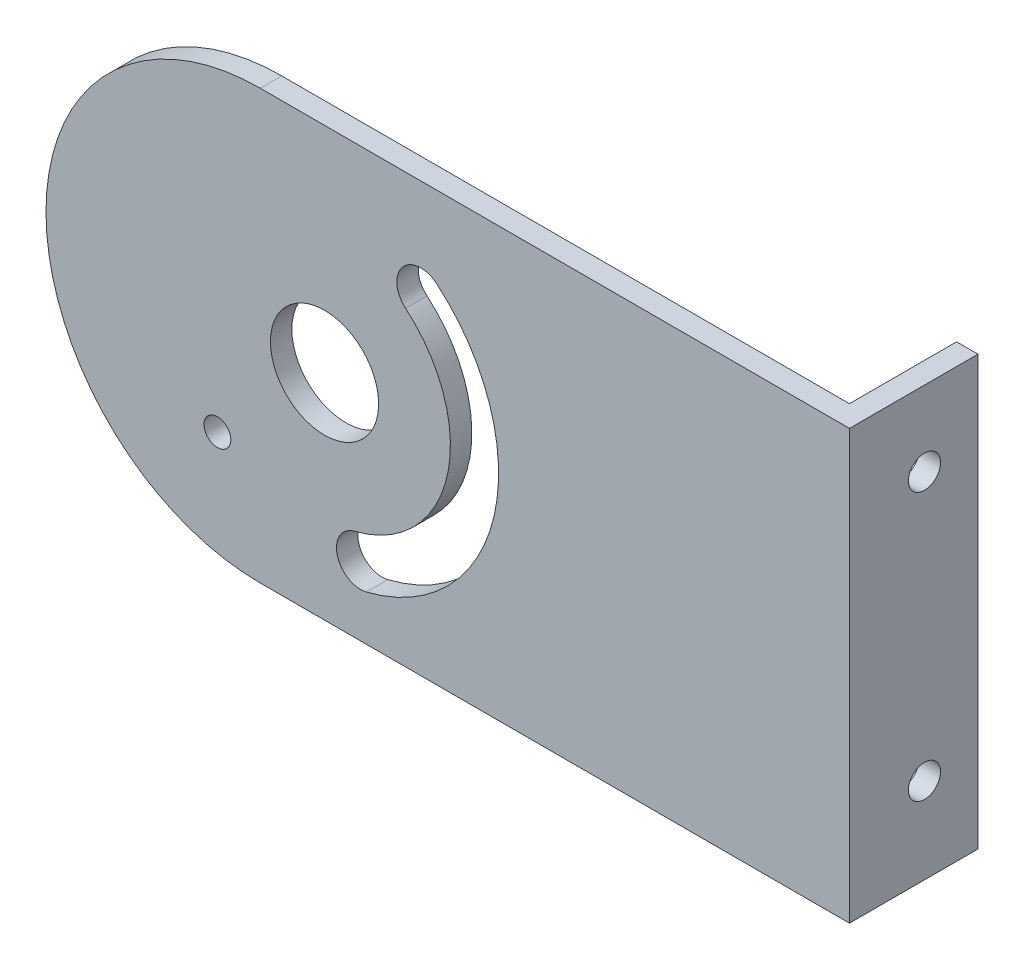
ISO-10303-21;
HEADER;
FILE_DESCRIPTION(('STEP AP214'),'2;1');
FILE_NAME('part.step','',(''),(''),'','','');
FILE_SCHEMA(('AUTOMOTIVE_DESIGN { 1 0 10303 214 1 1 1 1 }'));
ENDSEC;
DATA;
#1=APPLICATION_CONTEXT('core data for automotive mechanical design processes');
#2=APPLICATION_PROTOCOL_DEFINITION('international standard','automotive_design',2000,#1);
#3=PRODUCT_CONTEXT('',#1,'mechanical');
#4=PRODUCT('Part','Part','',(#3));
#5=PRODUCT_RELATED_PRODUCT_CATEGORY('part','',(#4));
#6=PRODUCT_DEFINITION_FORMATION('','',#4);
#7=PRODUCT_DEFINITION_CONTEXT('part definition',#1,'design');
#8=PRODUCT_DEFINITION('design','',#6,#7);
#9=PRODUCT_DEFINITION_SHAPE('','',#8);
#10=(LENGTH_UNIT() NAMED_UNIT(*) SI_UNIT(.MILLI.,.METRE.));
#11=(NAMED_UNIT(*) PLANE_ANGLE_UNIT() SI_UNIT($,.RADIAN.));
#12=(NAMED_UNIT(*) SI_UNIT($,.STERADIAN.) SOLID_ANGLE_UNIT());
#13=UNCERTAINTY_MEASURE_WITH_UNIT(LENGTH_MEASURE(1.E-05),#10,'distance_accuracy_value','');
#14=(GEOMETRIC_REPRESENTATION_CONTEXT(3) GLOBAL_UNCERTAINTY_ASSIGNED_CONTEXT((#13)) GLOBAL_UNIT_ASSIGNED_CONTEXT((#10,
#11,#12)) REPRESENTATION_CONTEXT('',''));
#15=CARTESIAN_POINT('',(0.,0.,0.));
#16=DIRECTION('',(0.,0.,1.));
#17=DIRECTION('',(1.,0.,0.));
#18=AXIS2_PLACEMENT_3D('',#15,#16,#17);
#19=CARTESIAN_POINT('',(75.,0.,2.));
#20=DIRECTION('',(0.,1.,0.));
#21=DIRECTION('',(-1.,0.,0.));
#22=AXIS2_PLACEMENT_3D('',#19,#20,#21);
#23=PLANE('',#22);
#24=DIRECTION('',(1.,0.,0.));
#25=VECTOR('',#24,1.);
#26=CARTESIAN_POINT('',(75.,0.,2.));
#27=LINE('',#26,#25);
#28=CARTESIAN_POINT('',(20.,0.,2.));
#29=VERTEX_POINT('',#28);
#30=CARTESIAN_POINT('',(75.,0.,2.));
#31=VERTEX_POINT('',#30);
#32=EDGE_CURVE('E211',#29,#31,#27,.T.);
#33=ORIENTED_EDGE('',*,*,#32,.F.);
#34=DIRECTION('',(0.,0.,-1.));
#35=VECTOR('',#34,1.);
#36=CARTESIAN_POINT('',(20.,0.,2.));
#37=LINE('',#36,#35);
#38=CARTESIAN_POINT('',(20.,0.,0.));
#39=VERTEX_POINT('',#38);
#40=EDGE_CURVE('E138',#29,#39,#37,.T.);
#41=ORIENTED_EDGE('',*,*,#40,.T.);
#42=DIRECTION('',(1.,0.,0.));
#43=VECTOR('',#42,1.);
#44=CARTESIAN_POINT('',(75.,0.,0.));
#45=LINE('',#44,#43);
#46=CARTESIAN_POINT('',(73.,0.,0.));
#47=VERTEX_POINT('',#46);
#48=EDGE_CURVE('E208',#39,#47,#45,.T.);
#49=ORIENTED_EDGE('',*,*,#48,.T.);
#50=DIRECTION('',(0.,0.,1.));
#51=VECTOR('',#50,1.);
#52=CARTESIAN_POINT('',(73.,0.,-10.));
#53=LINE('',#52,#51);
#54=CARTESIAN_POINT('',(73.,0.,-10.));
#55=VERTEX_POINT('',#54);
#56=EDGE_CURVE('E144',#55,#47,#53,.T.);
#57=ORIENTED_EDGE('',*,*,#56,.F.);
#58=DIRECTION('',(-1.,0.,0.));
#59=VECTOR('',#58,1.);
#60=CARTESIAN_POINT('',(75.,0.,-10.));
#61=LINE('',#60,#59);
#62=CARTESIAN_POINT('',(75.,0.,-10.));
#63=VERTEX_POINT('',#62);
#64=EDGE_CURVE('E142',#63,#55,#61,.T.);
#65=ORIENTED_EDGE('',*,*,#64,.F.);
#66=DIRECTION('',(0.,0.,-1.));
#67=VECTOR('',#66,1.);
#68=CARTESIAN_POINT('',(75.,0.,2.));
#69=LINE('',#68,#67);
#70=EDGE_CURVE('E129',#31,#63,#69,.T.);
#71=ORIENTED_EDGE('',*,*,#70,.F.);
#72=EDGE_LOOP('',(#33,#41,#49,#57,#65,#71));
#73=FACE_BOUND('',#72,.T.);
#74=ADVANCED_FACE('F43',(#73),#23,.F.);
#75=CARTESIAN_POINT('',(75.,40.,2.));
#76=DIRECTION('',(-1.,0.,0.));
#77=DIRECTION('',(0.,0.,1.));
#78=AXIS2_PLACEMENT_3D('',#75,#76,#77);
#79=PLANE('',#78);
#80=CARTESIAN_POINT('',(75.,33.,-5.));
#81=DIRECTION('',(-1.,0.,0.));
#82=DIRECTION('',(0.,0.,1.));
#83=AXIS2_PLACEMENT_3D('',#80,#81,#82);
#84=CIRCLE('',#83,1.5);
#85=CARTESIAN_POINT('',(75.,33.,-3.5));
#86=VERTEX_POINT('',#85);
#87=EDGE_CURVE('E154',#86,#86,#84,.T.);
#88=ORIENTED_EDGE('',*,*,#87,.T.);
#89=EDGE_LOOP('',(#88));
#90=FACE_BOUND('',#89,.T.);
#91=CARTESIAN_POINT('',(75.,8.,-5.));
#92=DIRECTION('',(-1.,0.,0.));
#93=DIRECTION('',(0.,0.,1.));
#94=AXIS2_PLACEMENT_3D('',#91,#92,#93);
#95=CIRCLE('',#94,1.5);
#96=CARTESIAN_POINT('',(75.,8.,-3.5));
#97=VERTEX_POINT('',#96);
#98=EDGE_CURVE('E157',#97,#97,#95,.T.);
#99=ORIENTED_EDGE('',*,*,#98,.T.);
#100=EDGE_LOOP('',(#99));
#101=FACE_BOUND('',#100,.T.);
#102=ORIENTED_EDGE('',*,*,#70,.T.);
#103=DIRECTION('',(0.,-1.,0.));
#104=VECTOR('',#103,1.);
#105=CARTESIAN_POINT('',(75.,0.,-10.));
#106=LINE('',#105,#104);
#107=CARTESIAN_POINT('',(75.,40.,-10.));
#108=VERTEX_POINT('',#107);
#109=EDGE_CURVE('E134',#108,#63,#106,.T.);
#110=ORIENTED_EDGE('',*,*,#109,.F.);
#111=DIRECTION('',(0.,0.,-1.));
#112=VECTOR('',#111,1.);
#113=CARTESIAN_POINT('',(75.,40.,2.));
#114=LINE('',#113,#112);
#115=CARTESIAN_POINT('',(75.,40.,2.));
#116=VERTEX_POINT('',#115);
#117=EDGE_CURVE('E139',#116,#108,#114,.T.);
#118=ORIENTED_EDGE('',*,*,#117,.F.);
#119=DIRECTION('',(0.,1.,0.));
#120=VECTOR('',#119,1.);
#121=CARTESIAN_POINT('',(75.,40.,2.));
#122=LINE('',#121,#120);
#123=EDGE_CURVE('E135',#31,#116,#122,.T.);
#124=ORIENTED_EDGE('',*,*,#123,.F.);
#125=EDGE_LOOP('',(#102,#110,#118,#124));
#126=FACE_BOUND('',#125,.T.);
#127=ADVANCED_FACE('F131',(#90,#101,#126),#79,.F.);
#128=CARTESIAN_POINT('',(0.,40.,2.));
#129=DIRECTION('',(0.,-1.,0.));
#130=DIRECTION('',(0.,0.,-1.));
#131=AXIS2_PLACEMENT_3D('',#128,#129,#130);
#132=PLANE('',#131);
#133=ORIENTED_EDGE('',*,*,#117,.T.);
#134=DIRECTION('',(1.,0.,0.));
#135=VECTOR('',#134,1.);
#136=CARTESIAN_POINT('',(75.,40.,-10.));
#137=LINE('',#136,#135);
#138=CARTESIAN_POINT('',(73.,40.,-10.));
#139=VERTEX_POINT('',#138);
#140=EDGE_CURVE('E152',#139,#108,#137,.T.);
#141=ORIENTED_EDGE('',*,*,#140,.F.);
#142=DIRECTION('',(0.,0.,1.));
#143=VECTOR('',#142,1.);
#144=CARTESIAN_POINT('',(73.,40.,-10.));
#145=LINE('',#144,#143);
#146=CARTESIAN_POINT('',(73.,40.,0.));
#147=VERTEX_POINT('',#146);
#148=EDGE_CURVE('E161',#139,#147,#145,.T.);
#149=ORIENTED_EDGE('',*,*,#148,.T.);
#150=DIRECTION('',(-1.,0.,0.));
#151=VECTOR('',#150,1.);
#152=CARTESIAN_POINT('',(0.,40.,0.));
#153=LINE('',#152,#151);
#154=CARTESIAN_POINT('',(20.,40.,0.));
#155=VERTEX_POINT('',#154);
#156=EDGE_CURVE('E213',#147,#155,#153,.T.);
#157=ORIENTED_EDGE('',*,*,#156,.T.);
#158=DIRECTION('',(0.,0.,-1.));
#159=VECTOR('',#158,1.);
#160=CARTESIAN_POINT('',(20.,40.,2.));
#161=LINE('',#160,#159);
#162=CARTESIAN_POINT('',(20.,40.,2.));
#163=VERTEX_POINT('',#162);
#164=EDGE_CURVE('E11',#155,#163,#161,.F.);
#165=ORIENTED_EDGE('',*,*,#164,.T.);
#166=DIRECTION('',(-1.,0.,0.));
#167=VECTOR('',#166,1.);
#168=CARTESIAN_POINT('',(0.,40.,2.));
#169=LINE('',#168,#167);
#170=EDGE_CURVE('E215',#116,#163,#169,.T.);
#171=ORIENTED_EDGE('',*,*,#170,.F.);
#172=EDGE_LOOP('',(#133,#141,#149,#157,#165,#171));
#173=FACE_BOUND('',#172,.T.);
#174=ADVANCED_FACE('F241',(#173),#132,.F.);
#175=CARTESIAN_POINT('',(0.,0.,2.));
#176=DIRECTION('',(0.,0.,-1.));
#177=DIRECTION('',(-1.,0.,0.));
#178=AXIS2_PLACEMENT_3D('',#175,#176,#177);
#179=PLANE('',#178);
#180=CARTESIAN_POINT('',(16.,10.2020410288673,2.));
#181=DIRECTION('',(0.,0.,-1.));
#182=DIRECTION('',(-1.,0.,0.));
#183=AXIS2_PLACEMENT_3D('',#180,#181,#182);
#184=CIRCLE('',#183,1.25);
#185=CARTESIAN_POINT('',(14.75,10.2020410288673,2.));
#186=VERTEX_POINT('',#185);
#187=EDGE_CURVE('E202',#186,#186,#184,.T.);
#188=ORIENTED_EDGE('',*,*,#187,.T.);
#189=EDGE_LOOP('',(#188));
#190=FACE_BOUND('',#189,.T.);
#191=CARTESIAN_POINT('',(26.,20.,2.));
#192=DIRECTION('',(0.,0.,1.));
#193=DIRECTION('',(-1.,0.,0.));
#194=AXIS2_PLACEMENT_3D('',#191,#192,#193);
#195=CIRCLE('',#194,11.75);
#196=CARTESIAN_POINT('',(28.825815980141,8.59485799972751,2.));
#197=VERTEX_POINT('',#196);
#198=CARTESIAN_POINT('',(33.5535714285714,29.0003365866766,2.));
#199=VERTEX_POINT('',#198);
#200=EDGE_CURVE('E169',#197,#199,#195,.T.);
#201=ORIENTED_EDGE('',*,*,#200,.T.);
#202=CARTESIAN_POINT('',(35.,30.7238052947636,2.));
#203=DIRECTION('',(0.,0.,-1.));
#204=DIRECTION('',(-1.,0.,0.));
#205=AXIS2_PLACEMENT_3D('',#202,#203,#204);
#206=CIRCLE('',#205,2.25000000000001);
#207=CARTESIAN_POINT('',(36.4464285714286,32.4472740028506,2.));
#208=VERTEX_POINT('',#207);
#209=EDGE_CURVE('E181',#199,#208,#206,.T.);
#210=ORIENTED_EDGE('',*,*,#209,.T.);
#211=CARTESIAN_POINT('',(26.,20.,2.));
#212=DIRECTION('',(0.,0.,-1.));
#213=DIRECTION('',(-1.,0.,0.));
#214=AXIS2_PLACEMENT_3D('',#211,#212,#213);
#215=CIRCLE('',#214,16.25);
#216=CARTESIAN_POINT('',(29.9080433767907,4.22693127621888,2.));
#217=VERTEX_POINT('',#216);
#218=EDGE_CURVE('E195',#208,#217,#215,.T.);
#219=ORIENTED_EDGE('',*,*,#218,.T.);
#220=CARTESIAN_POINT('',(29.3669296784659,6.4108946379732,2.));
#221=DIRECTION('',(0.,0.,-1.));
#222=DIRECTION('',(-1.,0.,0.));
#223=AXIS2_PLACEMENT_3D('',#220,#221,#222);
#224=CIRCLE('',#223,2.25000000000001);
#225=EDGE_CURVE('E192',#217,#197,#224,.T.);
#226=ORIENTED_EDGE('',*,*,#225,.T.);
#227=EDGE_LOOP('',(#201,#210,#219,#226));
#228=FACE_BOUND('',#227,.T.);
#229=CARTESIAN_POINT('',(26.,20.,2.));
#230=DIRECTION('',(0.,0.,-1.));
#231=DIRECTION('',(-1.,0.,0.));
#232=AXIS2_PLACEMENT_3D('',#229,#230,#231);
#233=CIRCLE('',#232,5.05);
#234=CARTESIAN_POINT('',(20.95,20.,2.));
#235=VERTEX_POINT('',#234);
#236=EDGE_CURVE('E205',#235,#235,#233,.T.);
#237=ORIENTED_EDGE('',*,*,#236,.T.);
#238=EDGE_LOOP('',(#237));
#239=FACE_BOUND('',#238,.T.);
#240=CARTESIAN_POINT('',(20.,20.,2.));
#241=DIRECTION('',(0.,0.,-1.));
#242=DIRECTION('',(-1.,0.,0.));
#243=AXIS2_PLACEMENT_3D('',#240,#241,#242);
#244=CIRCLE('',#243,20.);
#245=CARTESIAN_POINT('',(0.,20.,2.));
#246=VERTEX_POINT('',#245);
#247=EDGE_CURVE('E67',#163,#246,#244,.F.);
#248=ORIENTED_EDGE('',*,*,#247,.T.);
#249=CARTESIAN_POINT('',(20.,20.,2.));
#250=DIRECTION('',(0.,0.,-1.));
#251=DIRECTION('',(-1.,0.,0.));
#252=AXIS2_PLACEMENT_3D('',#249,#250,#251);
#253=CIRCLE('',#252,20.);
#254=EDGE_CURVE('E52',#246,#29,#253,.F.);
#255=ORIENTED_EDGE('',*,*,#254,.T.);
#256=ORIENTED_EDGE('',*,*,#32,.T.);
#257=ORIENTED_EDGE('',*,*,#123,.T.);
#258=ORIENTED_EDGE('',*,*,#170,.T.);
#259=EDGE_LOOP('',(#248,#255,#256,#257,#258));
#260=FACE_BOUND('',#259,.T.);
#261=ADVANCED_FACE('F229',(#190,#228,#239,#260),#179,.F.);
#262=CARTESIAN_POINT('',(0.,0.,0.));
#263=DIRECTION('',(0.,0.,-1.));
#264=DIRECTION('',(-1.,0.,0.));
#265=AXIS2_PLACEMENT_3D('',#262,#263,#264);
#266=PLANE('',#265);
#267=DIRECTION('',(0.,1.,0.));
#268=VECTOR('',#267,1.);
#269=CARTESIAN_POINT('',(73.,0.,0.));
#270=LINE('',#269,#268);
#271=EDGE_CURVE('E59',#47,#147,#270,.T.);
#272=ORIENTED_EDGE('',*,*,#271,.F.);
#273=ORIENTED_EDGE('',*,*,#48,.F.);
#274=CARTESIAN_POINT('',(20.,20.,0.));
#275=DIRECTION('',(0.,0.,-1.));
#276=DIRECTION('',(-1.,0.,0.));
#277=AXIS2_PLACEMENT_3D('',#274,#275,#276);
#278=CIRCLE('',#277,20.);
#279=CARTESIAN_POINT('',(0.,20.,0.));
#280=VERTEX_POINT('',#279);
#281=EDGE_CURVE('E225',#39,#280,#278,.T.);
#282=ORIENTED_EDGE('',*,*,#281,.T.);
#283=CARTESIAN_POINT('',(20.,20.,0.));
#284=DIRECTION('',(0.,0.,-1.));
#285=DIRECTION('',(-1.,0.,0.));
#286=AXIS2_PLACEMENT_3D('',#283,#284,#285);
#287=CIRCLE('',#286,20.);
#288=EDGE_CURVE('E222',#280,#155,#287,.T.);
#289=ORIENTED_EDGE('',*,*,#288,.T.);
#290=ORIENTED_EDGE('',*,*,#156,.F.);
#291=EDGE_LOOP('',(#272,#273,#282,#289,#290));
#292=FACE_BOUND('',#291,.T.);
#293=CARTESIAN_POINT('',(16.,10.2020410288673,0.));
#294=DIRECTION('',(0.,0.,-1.));
#295=DIRECTION('',(-1.,0.,0.));
#296=AXIS2_PLACEMENT_3D('',#293,#294,#295);
#297=CIRCLE('',#296,1.25);
#298=CARTESIAN_POINT('',(14.75,10.2020410288673,0.));
#299=VERTEX_POINT('',#298);
#300=EDGE_CURVE('E176',#299,#299,#297,.T.);
#301=ORIENTED_EDGE('',*,*,#300,.F.);
#302=EDGE_LOOP('',(#301));
#303=FACE_BOUND('',#302,.T.);
#304=CARTESIAN_POINT('',(35.,30.7238052947636,0.));
#305=DIRECTION('',(0.,0.,-1.));
#306=DIRECTION('',(-1.,0.,0.));
#307=AXIS2_PLACEMENT_3D('',#304,#305,#306);
#308=CIRCLE('',#307,2.25000000000001);
#309=CARTESIAN_POINT('',(33.5535714285714,29.0003365866766,0.));
#310=VERTEX_POINT('',#309);
#311=CARTESIAN_POINT('',(36.4464285714286,32.4472740028506,0.));
#312=VERTEX_POINT('',#311);
#313=EDGE_CURVE('E187',#310,#312,#308,.T.);
#314=ORIENTED_EDGE('',*,*,#313,.F.);
#315=CARTESIAN_POINT('',(26.,20.,0.));
#316=DIRECTION('',(0.,0.,1.));
#317=DIRECTION('',(-1.,0.,0.));
#318=AXIS2_PLACEMENT_3D('',#315,#316,#317);
#319=CIRCLE('',#318,11.75);
#320=CARTESIAN_POINT('',(28.825815980141,8.59485799972751,0.));
#321=VERTEX_POINT('',#320);
#322=EDGE_CURVE('E177',#321,#310,#319,.T.);
#323=ORIENTED_EDGE('',*,*,#322,.F.);
#324=CARTESIAN_POINT('',(29.3669296784659,6.4108946379732,0.));
#325=DIRECTION('',(0.,0.,-1.));
#326=DIRECTION('',(-1.,0.,0.));
#327=AXIS2_PLACEMENT_3D('',#324,#325,#326);
#328=CIRCLE('',#327,2.25000000000001);
#329=CARTESIAN_POINT('',(29.9080433767907,4.22693127621888,0.));
#330=VERTEX_POINT('',#329);
#331=EDGE_CURVE('E180',#330,#321,#328,.T.);
#332=ORIENTED_EDGE('',*,*,#331,.F.);
#333=CARTESIAN_POINT('',(26.,20.,0.));
#334=DIRECTION('',(0.,0.,-1.));
#335=DIRECTION('',(-1.,0.,0.));
#336=AXIS2_PLACEMENT_3D('',#333,#334,#335);
#337=CIRCLE('',#336,16.25);
#338=EDGE_CURVE('E184',#312,#330,#337,.T.);
#339=ORIENTED_EDGE('',*,*,#338,.F.);
#340=EDGE_LOOP('',(#314,#323,#332,#339));
#341=FACE_BOUND('',#340,.T.);
#342=CARTESIAN_POINT('',(26.,20.,0.));
#343=DIRECTION('',(0.,0.,-1.));
#344=DIRECTION('',(-1.,0.,0.));
#345=AXIS2_PLACEMENT_3D('',#342,#343,#344);
#346=CIRCLE('',#345,5.05);
#347=CARTESIAN_POINT('',(20.95,20.,0.));
#348=VERTEX_POINT('',#347);
#349=EDGE_CURVE('E189',#348,#348,#346,.T.);
#350=ORIENTED_EDGE('',*,*,#349,.F.);
#351=EDGE_LOOP('',(#350));
#352=FACE_BOUND('',#351,.T.);
#353=ADVANCED_FACE('F235',(#292,#303,#341,#352),#266,.T.);
#354=CARTESIAN_POINT('',(26.,20.,2.));
#355=DIRECTION('',(0.,0.,-1.));
#356=DIRECTION('',(-1.,0.,0.));
#357=AXIS2_PLACEMENT_3D('',#354,#355,#356);
#358=CYLINDRICAL_SURFACE('',#357,5.05);
#359=ORIENTED_EDGE('',*,*,#236,.F.);
#360=EDGE_LOOP('',(#359));
#361=FACE_BOUND('',#360,.T.);
#362=ORIENTED_EDGE('',*,*,#349,.T.);
#363=EDGE_LOOP('',(#362));
#364=FACE_BOUND('',#363,.T.);
#365=ADVANCED_FACE('F270',(#361,#364),#358,.F.);
#366=CARTESIAN_POINT('',(35.,30.7238052947636,2.));
#367=DIRECTION('',(0.,0.,-1.));
#368=DIRECTION('',(-1.,0.,0.));
#369=AXIS2_PLACEMENT_3D('',#366,#367,#368);
#370=CYLINDRICAL_SURFACE('',#369,2.25000000000001);
#371=ORIENTED_EDGE('',*,*,#313,.T.);
#372=DIRECTION('',(0.,0.,-1.));
#373=VECTOR('',#372,1.);
#374=CARTESIAN_POINT('',(36.4464285714286,32.4472740028506,2.));
#375=LINE('',#374,#373);
#376=EDGE_CURVE('E166',#208,#312,#375,.T.);
#377=ORIENTED_EDGE('',*,*,#376,.F.);
#378=ORIENTED_EDGE('',*,*,#209,.F.);
#379=DIRECTION('',(0.,0.,-1.));
#380=VECTOR('',#379,1.);
#381=CARTESIAN_POINT('',(33.5535714285714,29.0003365866766,2.));
#382=LINE('',#381,#380);
#383=EDGE_CURVE('E174',#199,#310,#382,.T.);
#384=ORIENTED_EDGE('',*,*,#383,.T.);
#385=EDGE_LOOP('',(#371,#377,#378,#384));
#386=FACE_BOUND('',#385,.T.);
#387=ADVANCED_FACE('F276',(#386),#370,.F.);
#388=CARTESIAN_POINT('',(26.,20.,2.));
#389=DIRECTION('',(0.,0.,-1.));
#390=DIRECTION('',(-1.,0.,0.));
#391=AXIS2_PLACEMENT_3D('',#388,#389,#390);
#392=CYLINDRICAL_SURFACE('',#391,11.75);
#393=ORIENTED_EDGE('',*,*,#322,.T.);
#394=ORIENTED_EDGE('',*,*,#383,.F.);
#395=ORIENTED_EDGE('',*,*,#200,.F.);
#396=DIRECTION('',(0.,0.,-1.));
#397=VECTOR('',#396,1.);
#398=CARTESIAN_POINT('',(28.825815980141,8.59485799972751,2.));
#399=LINE('',#398,#397);
#400=EDGE_CURVE('E172',#197,#321,#399,.T.);
#401=ORIENTED_EDGE('',*,*,#400,.T.);
#402=EDGE_LOOP('',(#393,#394,#395,#401));
#403=FACE_BOUND('',#402,.T.);
#404=ADVANCED_FACE('F283',(#403),#392,.T.);
#405=CARTESIAN_POINT('',(29.3669296784659,6.4108946379732,2.));
#406=DIRECTION('',(0.,0.,-1.));
#407=DIRECTION('',(-1.,0.,0.));
#408=AXIS2_PLACEMENT_3D('',#405,#406,#407);
#409=CYLINDRICAL_SURFACE('',#408,2.25000000000001);
#410=ORIENTED_EDGE('',*,*,#331,.T.);
#411=ORIENTED_EDGE('',*,*,#400,.F.);
#412=ORIENTED_EDGE('',*,*,#225,.F.);
#413=DIRECTION('',(0.,0.,-1.));
#414=VECTOR('',#413,1.);
#415=CARTESIAN_POINT('',(29.9080433767907,4.22693127621888,2.));
#416=LINE('',#415,#414);
#417=EDGE_CURVE('E170',#217,#330,#416,.T.);
#418=ORIENTED_EDGE('',*,*,#417,.T.);
#419=EDGE_LOOP('',(#410,#411,#412,#418));
#420=FACE_BOUND('',#419,.T.);
#421=ADVANCED_FACE('F286',(#420),#409,.F.);
#422=CARTESIAN_POINT('',(26.,20.,2.));
#423=DIRECTION('',(0.,0.,-1.));
#424=DIRECTION('',(-1.,0.,0.));
#425=AXIS2_PLACEMENT_3D('',#422,#423,#424);
#426=CYLINDRICAL_SURFACE('',#425,16.25);
#427=ORIENTED_EDGE('',*,*,#338,.T.);
#428=ORIENTED_EDGE('',*,*,#417,.F.);
#429=ORIENTED_EDGE('',*,*,#218,.F.);
#430=ORIENTED_EDGE('',*,*,#376,.T.);
#431=EDGE_LOOP('',(#427,#428,#429,#430));
#432=FACE_BOUND('',#431,.T.);
#433=ADVANCED_FACE('F281',(#432),#426,.F.);
#434=CARTESIAN_POINT('',(16.,10.2020410288673,2.));
#435=DIRECTION('',(0.,0.,-1.));
#436=DIRECTION('',(-1.,0.,0.));
#437=AXIS2_PLACEMENT_3D('',#434,#435,#436);
#438=CYLINDRICAL_SURFACE('',#437,1.25);
#439=ORIENTED_EDGE('',*,*,#187,.F.);
#440=EDGE_LOOP('',(#439));
#441=FACE_BOUND('',#440,.T.);
#442=ORIENTED_EDGE('',*,*,#300,.T.);
#443=EDGE_LOOP('',(#442));
#444=FACE_BOUND('',#443,.T.);
#445=ADVANCED_FACE('F278',(#441,#444),#438,.F.);
#446=CARTESIAN_POINT('',(20.,20.,2.));
#447=DIRECTION('',(0.,0.,-1.));
#448=DIRECTION('',(-1.,0.,0.));
#449=AXIS2_PLACEMENT_3D('',#446,#447,#448);
#450=CYLINDRICAL_SURFACE('',#449,20.);
#451=DIRECTION('',(0.,0.,-1.));
#452=VECTOR('',#451,1.);
#453=CARTESIAN_POINT('',(0.,20.,2.));
#454=LINE('',#453,#452);
#455=EDGE_CURVE('E47',#246,#280,#454,.T.);
#456=ORIENTED_EDGE('',*,*,#455,.F.);
#457=ORIENTED_EDGE('',*,*,#247,.F.);
#458=ORIENTED_EDGE('',*,*,#164,.F.);
#459=ORIENTED_EDGE('',*,*,#288,.F.);
#460=EDGE_LOOP('',(#456,#457,#458,#459));
#461=FACE_BOUND('',#460,.T.);
#462=ADVANCED_FACE('F45',(#461),#450,.T.);
#463=CARTESIAN_POINT('',(20.,20.,2.));
#464=DIRECTION('',(0.,0.,-1.));
#465=DIRECTION('',(-1.,0.,0.));
#466=AXIS2_PLACEMENT_3D('',#463,#464,#465);
#467=CYLINDRICAL_SURFACE('',#466,20.);
#468=ORIENTED_EDGE('',*,*,#254,.F.);
#469=ORIENTED_EDGE('',*,*,#455,.T.);
#470=ORIENTED_EDGE('',*,*,#281,.F.);
#471=ORIENTED_EDGE('',*,*,#40,.F.);
#472=EDGE_LOOP('',(#468,#469,#470,#471));
#473=FACE_BOUND('',#472,.T.);
#474=ADVANCED_FACE('F233',(#473),#467,.T.);
#475=CARTESIAN_POINT('',(73.,0.,-10.));
#476=DIRECTION('',(1.,0.,0.));
#477=DIRECTION('',(0.,0.,-1.));
#478=AXIS2_PLACEMENT_3D('',#475,#476,#477);
#479=PLANE('',#478);
#480=CARTESIAN_POINT('',(73.,33.,-5.));
#481=DIRECTION('',(-1.,0.,0.));
#482=DIRECTION('',(0.,0.,1.));
#483=AXIS2_PLACEMENT_3D('',#480,#481,#482);
#484=CIRCLE('',#483,1.5);
#485=CARTESIAN_POINT('',(73.,33.,-3.5));
#486=VERTEX_POINT('',#485);
#487=EDGE_CURVE('E409',#486,#486,#484,.T.);
#488=ORIENTED_EDGE('',*,*,#487,.F.);
#489=EDGE_LOOP('',(#488));
#490=FACE_BOUND('',#489,.T.);
#491=CARTESIAN_POINT('',(73.,8.,-5.));
#492=DIRECTION('',(-1.,0.,0.));
#493=DIRECTION('',(0.,0.,1.));
#494=AXIS2_PLACEMENT_3D('',#491,#492,#493);
#495=CIRCLE('',#494,1.5);
#496=CARTESIAN_POINT('',(73.,8.,-3.5));
#497=VERTEX_POINT('',#496);
#498=EDGE_CURVE('E410',#497,#497,#495,.T.);
#499=ORIENTED_EDGE('',*,*,#498,.F.);
#500=EDGE_LOOP('',(#499));
#501=FACE_BOUND('',#500,.T.);
#502=ORIENTED_EDGE('',*,*,#271,.T.);
#503=ORIENTED_EDGE('',*,*,#148,.F.);
#504=DIRECTION('',(0.,1.,0.));
#505=VECTOR('',#504,1.);
#506=CARTESIAN_POINT('',(73.,0.,-10.));
#507=LINE('',#506,#505);
#508=EDGE_CURVE('E147',#55,#139,#507,.T.);
#509=ORIENTED_EDGE('',*,*,#508,.F.);
#510=ORIENTED_EDGE('',*,*,#56,.T.);
#511=EDGE_LOOP('',(#502,#503,#509,#510));
#512=FACE_BOUND('',#511,.T.);
#513=ADVANCED_FACE('F244',(#490,#501,#512),#479,.F.);
#514=CARTESIAN_POINT('',(0.,0.,-10.));
#515=DIRECTION('',(0.,0.,1.));
#516=DIRECTION('',(1.,0.,0.));
#517=AXIS2_PLACEMENT_3D('',#514,#515,#516);
#518=PLANE('',#517);
#519=ORIENTED_EDGE('',*,*,#109,.T.);
#520=ORIENTED_EDGE('',*,*,#64,.T.);
#521=ORIENTED_EDGE('',*,*,#508,.T.);
#522=ORIENTED_EDGE('',*,*,#140,.T.);
#523=EDGE_LOOP('',(#519,#520,#521,#522));
#524=FACE_BOUND('',#523,.T.);
#525=ADVANCED_FACE('F150',(#524),#518,.F.);
#526=CARTESIAN_POINT('',(75.,8.,-5.));
#527=DIRECTION('',(-1.,0.,0.));
#528=DIRECTION('',(0.,0.,1.));
#529=AXIS2_PLACEMENT_3D('',#526,#527,#528);
#530=CYLINDRICAL_SURFACE('',#529,1.5);
#531=ORIENTED_EDGE('',*,*,#98,.F.);
#532=EDGE_LOOP('',(#531));
#533=FACE_BOUND('',#532,.T.);
#534=ORIENTED_EDGE('',*,*,#498,.T.);
#535=EDGE_LOOP('',(#534));
#536=FACE_BOUND('',#535,.T.);
#537=ADVANCED_FACE('F253',(#533,#536),#530,.F.);
#538=CARTESIAN_POINT('',(75.,33.,-5.));
#539=DIRECTION('',(-1.,0.,0.));
#540=DIRECTION('',(0.,0.,1.));
#541=AXIS2_PLACEMENT_3D('',#538,#539,#540);
#542=CYLINDRICAL_SURFACE('',#541,1.5);
#543=ORIENTED_EDGE('',*,*,#87,.F.);
#544=EDGE_LOOP('',(#543));
#545=FACE_BOUND('',#544,.T.);
#546=ORIENTED_EDGE('',*,*,#487,.T.);
#547=EDGE_LOOP('',(#546));
#548=FACE_BOUND('',#547,.T.);
#549=ADVANCED_FACE('F392',(#545,#548),#542,.F.);
#550=CLOSED_SHELL('',(#74,#127,#174,#261,#353,#365,#387,#404,#421,#433,#445,#462,#474,#513,#525,
#537,#549));
#551=MANIFOLD_SOLID_BREP('B2',#550);
#552=ADVANCED_BREP_SHAPE_REPRESENTATION('',(#18,#551),#14);
#553=SHAPE_DEFINITION_REPRESENTATION(#9,#552);
ENDSEC;
END-ISO-10303-21;
